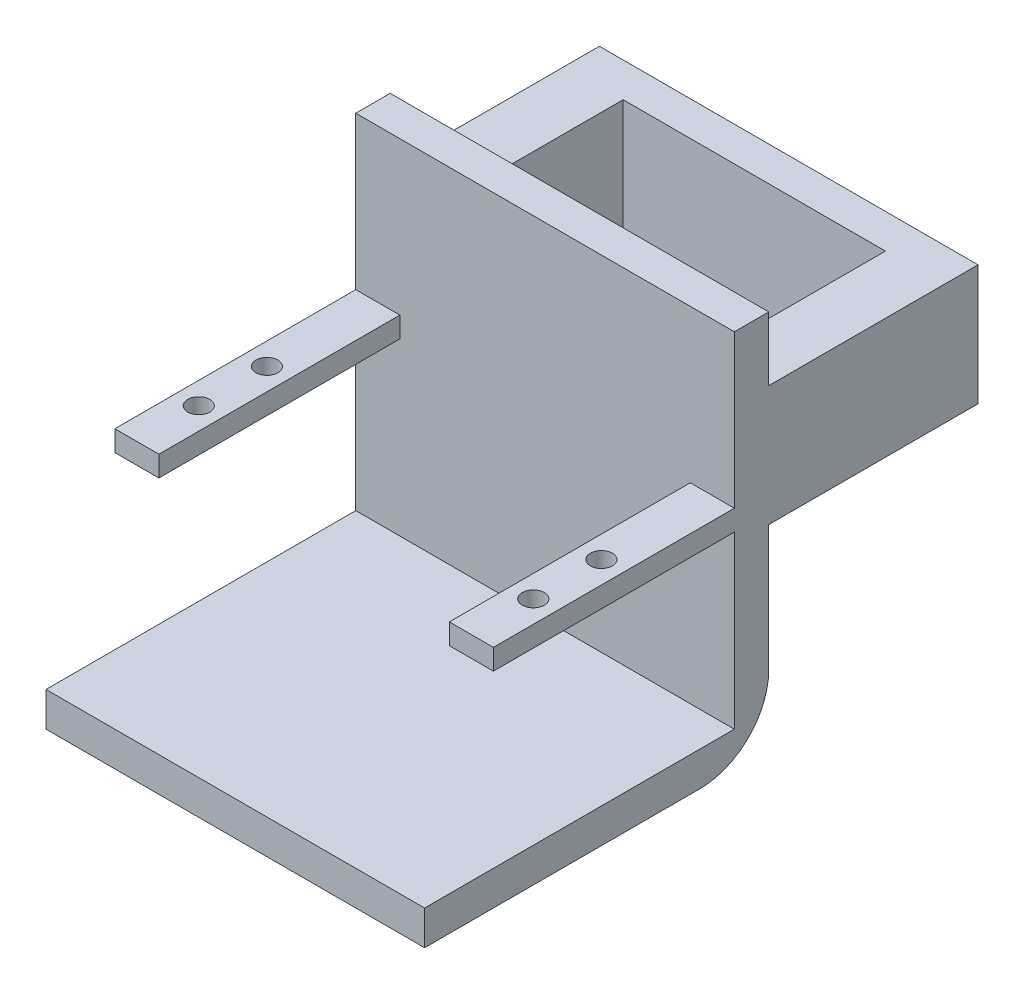
ISO-10303-21;
HEADER;
FILE_DESCRIPTION(('STEP AP214'),'2;1');
FILE_NAME('part.step','',(''),(''),'','','');
FILE_SCHEMA(('AUTOMOTIVE_DESIGN { 1 0 10303 214 1 1 1 1 }'));
ENDSEC;
DATA;
#1=APPLICATION_CONTEXT('core data for automotive mechanical design processes');
#2=APPLICATION_PROTOCOL_DEFINITION('international standard','automotive_design',2000,#1);
#3=PRODUCT_CONTEXT('',#1,'mechanical');
#4=PRODUCT('Part','Part','',(#3));
#5=PRODUCT_RELATED_PRODUCT_CATEGORY('part','',(#4));
#6=PRODUCT_DEFINITION_FORMATION('','',#4);
#7=PRODUCT_DEFINITION_CONTEXT('part definition',#1,'design');
#8=PRODUCT_DEFINITION('design','',#6,#7);
#9=PRODUCT_DEFINITION_SHAPE('','',#8);
#10=(LENGTH_UNIT() NAMED_UNIT(*) SI_UNIT(.MILLI.,.METRE.));
#11=(NAMED_UNIT(*) PLANE_ANGLE_UNIT() SI_UNIT($,.RADIAN.));
#12=(NAMED_UNIT(*) SI_UNIT($,.STERADIAN.) SOLID_ANGLE_UNIT());
#13=UNCERTAINTY_MEASURE_WITH_UNIT(LENGTH_MEASURE(1.E-05),#10,'distance_accuracy_value','');
#14=(GEOMETRIC_REPRESENTATION_CONTEXT(3) GLOBAL_UNCERTAINTY_ASSIGNED_CONTEXT((#13)) GLOBAL_UNIT_ASSIGNED_CONTEXT((#10,
#11,#12)) REPRESENTATION_CONTEXT('',''));
#15=CARTESIAN_POINT('',(0.,0.,0.));
#16=DIRECTION('',(0.,0.,1.));
#17=DIRECTION('',(1.,0.,0.));
#18=AXIS2_PLACEMENT_3D('',#15,#16,#17);
#19=CARTESIAN_POINT('',(0.,0.,0.));
#20=DIRECTION('',(0.,0.,1.));
#21=DIRECTION('',(1.,0.,0.));
#22=AXIS2_PLACEMENT_3D('',#19,#20,#21);
#23=PLANE('',#22);
#24=DIRECTION('',(-1.,0.,0.));
#25=VECTOR('',#24,1.);
#26=CARTESIAN_POINT('',(-11.9640127388535,1.13490563769142,0.));
#27=LINE('',#26,#25);
#28=CARTESIAN_POINT('',(-11.9640127388535,1.13490563769142,0.));
#29=VERTEX_POINT('',#28);
#30=CARTESIAN_POINT('',(-20.4140127388535,1.13490563769142,0.));
#31=VERTEX_POINT('',#30);
#32=EDGE_CURVE('E61',#29,#31,#27,.T.);
#33=ORIENTED_EDGE('',*,*,#32,.F.);
#34=DIRECTION('',(0.,-1.,0.));
#35=VECTOR('',#34,1.);
#36=CARTESIAN_POINT('',(-11.9640127388535,18.6220164240349,0.));
#37=LINE('',#36,#35);
#38=CARTESIAN_POINT('',(-11.9640127388535,18.6220164240349,0.));
#39=VERTEX_POINT('',#38);
#40=EDGE_CURVE('E249',#39,#29,#37,.T.);
#41=ORIENTED_EDGE('',*,*,#40,.F.);
#42=DIRECTION('',(1.,0.,0.));
#43=VECTOR('',#42,1.);
#44=CARTESIAN_POINT('',(-11.9640127388535,18.6220164240349,0.));
#45=LINE('',#44,#43);
#46=CARTESIAN_POINT('',(-20.4140127388535,18.6220164240349,0.));
#47=VERTEX_POINT('',#46);
#48=EDGE_CURVE('E248',#47,#39,#45,.T.);
#49=ORIENTED_EDGE('',*,*,#48,.F.);
#50=DIRECTION('',(0.,-1.,0.));
#51=VECTOR('',#50,1.);
#52=CARTESIAN_POINT('',(-20.4140127388535,27.8980891719745,0.));
#53=LINE('',#52,#51);
#54=CARTESIAN_POINT('',(-20.4140127388535,27.8980891719745,0.));
#55=VERTEX_POINT('',#54);
#56=EDGE_CURVE('E442',#55,#47,#53,.T.);
#57=ORIENTED_EDGE('',*,*,#56,.F.);
#58=DIRECTION('',(-1.,0.,0.));
#59=VECTOR('',#58,1.);
#60=CARTESIAN_POINT('',(-20.4140127388535,27.8980891719745,0.));
#61=LINE('',#60,#59);
#62=CARTESIAN_POINT('',(34.5859872611465,27.8980891719745,0.));
#63=VERTEX_POINT('',#62);
#64=EDGE_CURVE('E434',#63,#55,#61,.T.);
#65=ORIENTED_EDGE('',*,*,#64,.F.);
#66=DIRECTION('',(0.,1.,0.));
#67=VECTOR('',#66,1.);
#68=CARTESIAN_POINT('',(34.5859872611465,27.8980891719745,0.));
#69=LINE('',#68,#67);
#70=CARTESIAN_POINT('',(34.5859872611465,18.6220164240349,0.));
#71=VERTEX_POINT('',#70);
#72=EDGE_CURVE('E446',#71,#63,#69,.T.);
#73=ORIENTED_EDGE('',*,*,#72,.F.);
#74=DIRECTION('',(1.,0.,0.));
#75=VECTOR('',#74,1.);
#76=CARTESIAN_POINT('',(26.1359872611465,18.6220164240349,0.));
#77=LINE('',#76,#75);
#78=CARTESIAN_POINT('',(26.1359872611465,18.6220164240349,0.));
#79=VERTEX_POINT('',#78);
#80=EDGE_CURVE('E283',#79,#71,#77,.T.);
#81=ORIENTED_EDGE('',*,*,#80,.F.);
#82=DIRECTION('',(0.,1.,0.));
#83=VECTOR('',#82,1.);
#84=CARTESIAN_POINT('',(26.1359872611465,18.6220164240349,0.));
#85=LINE('',#84,#83);
#86=CARTESIAN_POINT('',(26.1359872611465,1.13490563769142,0.));
#87=VERTEX_POINT('',#86);
#88=EDGE_CURVE('E68',#87,#79,#85,.T.);
#89=ORIENTED_EDGE('',*,*,#88,.F.);
#90=DIRECTION('',(-1.,0.,0.));
#91=VECTOR('',#90,1.);
#92=CARTESIAN_POINT('',(26.1359872611465,1.13490563769142,0.));
#93=LINE('',#92,#91);
#94=CARTESIAN_POINT('',(34.5859872611465,1.13490563769142,0.));
#95=VERTEX_POINT('',#94);
#96=EDGE_CURVE('E253',#95,#87,#93,.T.);
#97=ORIENTED_EDGE('',*,*,#96,.F.);
#98=CARTESIAN_POINT('',(34.5859872611465,-17.1019108280255,0.));
#99=VERTEX_POINT('',#98);
#100=EDGE_CURVE('E208',#99,#95,#69,.T.);
#101=ORIENTED_EDGE('',*,*,#100,.F.);
#102=DIRECTION('',(-1.,0.,0.));
#103=VECTOR('',#102,1.);
#104=CARTESIAN_POINT('',(0.,-17.1019108280255,0.));
#105=LINE('',#104,#103);
#106=CARTESIAN_POINT('',(-20.4140127388535,-17.1019108280255,0.));
#107=VERTEX_POINT('',#106);
#108=EDGE_CURVE('E465',#99,#107,#105,.T.);
#109=ORIENTED_EDGE('',*,*,#108,.T.);
#110=EDGE_CURVE('E427',#31,#107,#53,.T.);
#111=ORIENTED_EDGE('',*,*,#110,.F.);
#112=EDGE_LOOP('',(#33,#41,#49,#57,#65,#73,#81,#89,#97,#101,#109,#111));
#113=FACE_BOUND('',#112,.T.);
#114=ADVANCED_FACE('F45',(#113),#23,.F.);
#115=CARTESIAN_POINT('',(0.,0.,5.));
#116=DIRECTION('',(0.,0.,1.));
#117=DIRECTION('',(1.,0.,0.));
#118=AXIS2_PLACEMENT_3D('',#115,#116,#117);
#119=PLANE('',#118);
#120=DIRECTION('',(0.,1.,0.));
#121=VECTOR('',#120,1.);
#122=CARTESIAN_POINT('',(34.5859872611465,27.8980891719745,5.));
#123=LINE('',#122,#121);
#124=CARTESIAN_POINT('',(34.5859872611465,-22.1019108280255,5.));
#125=VERTEX_POINT('',#124);
#126=CARTESIAN_POINT('',(34.5859872611465,2.69808917197453,5.));
#127=VERTEX_POINT('',#126);
#128=EDGE_CURVE('E413',#125,#127,#123,.T.);
#129=ORIENTED_EDGE('',*,*,#128,.T.);
#130=DIRECTION('',(1.,0.,0.));
#131=VECTOR('',#130,1.);
#132=CARTESIAN_POINT('',(28.1859872611465,2.69808917197453,5.));
#133=LINE('',#132,#131);
#134=CARTESIAN_POINT('',(28.1859872611465,2.69808917197453,5.));
#135=VERTEX_POINT('',#134);
#136=EDGE_CURVE('E341',#135,#127,#133,.T.);
#137=ORIENTED_EDGE('',*,*,#136,.F.);
#138=DIRECTION('',(0.,-1.,0.));
#139=VECTOR('',#138,1.);
#140=CARTESIAN_POINT('',(28.1859872611465,5.69808917197453,5.));
#141=LINE('',#140,#139);
#142=CARTESIAN_POINT('',(28.1859872611465,5.69808917197453,5.));
#143=VERTEX_POINT('',#142);
#144=EDGE_CURVE('E331',#143,#135,#141,.T.);
#145=ORIENTED_EDGE('',*,*,#144,.F.);
#146=DIRECTION('',(-1.,0.,0.));
#147=VECTOR('',#146,1.);
#148=CARTESIAN_POINT('',(34.5859872611465,5.69808917197453,5.));
#149=LINE('',#148,#147);
#150=CARTESIAN_POINT('',(34.5859872611465,5.69808917197453,5.));
#151=VERTEX_POINT('',#150);
#152=EDGE_CURVE('E345',#151,#143,#149,.T.);
#153=ORIENTED_EDGE('',*,*,#152,.F.);
#154=CARTESIAN_POINT('',(34.5859872611465,27.8980891719745,5.));
#155=VERTEX_POINT('',#154);
#156=EDGE_CURVE('E412',#151,#155,#123,.T.);
#157=ORIENTED_EDGE('',*,*,#156,.T.);
#158=DIRECTION('',(-1.,0.,0.));
#159=VECTOR('',#158,1.);
#160=CARTESIAN_POINT('',(-20.4140127388535,27.8980891719745,5.));
#161=LINE('',#160,#159);
#162=CARTESIAN_POINT('',(-20.4140127388535,27.8980891719745,5.));
#163=VERTEX_POINT('',#162);
#164=EDGE_CURVE('E417',#155,#163,#161,.T.);
#165=ORIENTED_EDGE('',*,*,#164,.T.);
#166=DIRECTION('',(0.,-1.,0.));
#167=VECTOR('',#166,1.);
#168=CARTESIAN_POINT('',(-20.4140127388535,27.8980891719745,5.));
#169=LINE('',#168,#167);
#170=CARTESIAN_POINT('',(-20.4140127388535,5.69808917197452,5.));
#171=VERTEX_POINT('',#170);
#172=EDGE_CURVE('E404',#163,#171,#169,.T.);
#173=ORIENTED_EDGE('',*,*,#172,.T.);
#174=DIRECTION('',(-1.,0.,0.));
#175=VECTOR('',#174,1.);
#176=CARTESIAN_POINT('',(-20.4140127388535,5.69808917197452,5.));
#177=LINE('',#176,#175);
#178=CARTESIAN_POINT('',(-14.0140127388535,5.69808917197452,5.));
#179=VERTEX_POINT('',#178);
#180=EDGE_CURVE('E381',#179,#171,#177,.T.);
#181=ORIENTED_EDGE('',*,*,#180,.F.);
#182=DIRECTION('',(0.,1.,0.));
#183=VECTOR('',#182,1.);
#184=CARTESIAN_POINT('',(-14.0140127388535,5.69808917197452,5.));
#185=LINE('',#184,#183);
#186=CARTESIAN_POINT('',(-14.0140127388535,2.69808917197453,5.));
#187=VERTEX_POINT('',#186);
#188=EDGE_CURVE('E385',#187,#179,#185,.T.);
#189=ORIENTED_EDGE('',*,*,#188,.F.);
#190=DIRECTION('',(1.,0.,0.));
#191=VECTOR('',#190,1.);
#192=CARTESIAN_POINT('',(-14.0140127388535,2.69808917197453,5.));
#193=LINE('',#192,#191);
#194=CARTESIAN_POINT('',(-20.4140127388535,2.69808917197453,5.));
#195=VERTEX_POINT('',#194);
#196=EDGE_CURVE('E346',#195,#187,#193,.T.);
#197=ORIENTED_EDGE('',*,*,#196,.F.);
#198=CARTESIAN_POINT('',(-20.4140127388535,-22.1019108280255,5.));
#199=VERTEX_POINT('',#198);
#200=EDGE_CURVE('E408',#195,#199,#169,.T.);
#201=ORIENTED_EDGE('',*,*,#200,.T.);
#202=DIRECTION('',(1.,0.,0.));
#203=VECTOR('',#202,1.);
#204=CARTESIAN_POINT('',(-20.4140127388535,-22.1019108280255,5.));
#205=LINE('',#204,#203);
#206=EDGE_CURVE('E407',#199,#125,#205,.T.);
#207=ORIENTED_EDGE('',*,*,#206,.T.);
#208=EDGE_LOOP('',(#129,#137,#145,#153,#157,#165,#173,#181,#189,#197,#201,#207));
#209=FACE_BOUND('',#208,.T.);
#210=ADVANCED_FACE('F510',(#209),#119,.T.);
#211=CARTESIAN_POINT('',(0.,-17.1019108280255,10.));
#212=DIRECTION('',(-1.,0.,0.));
#213=DIRECTION('',(0.,0.,1.));
#214=AXIS2_PLACEMENT_3D('',#211,#212,#213);
#215=CYLINDRICAL_SURFACE('',#214,10.);
#216=ORIENTED_EDGE('',*,*,#108,.F.);
#217=CARTESIAN_POINT('',(34.5859872611465,-17.1019108280255,10.));
#218=DIRECTION('',(-1.,0.,0.));
#219=DIRECTION('',(0.,-1.,0.));
#220=AXIS2_PLACEMENT_3D('',#217,#218,#219);
#221=CIRCLE('',#220,10.);
#222=CARTESIAN_POINT('',(34.5859872611465,-27.1019108280255,9.99999999999999));
#223=VERTEX_POINT('',#222);
#224=EDGE_CURVE('E54',#223,#99,#221,.F.);
#225=ORIENTED_EDGE('',*,*,#224,.F.);
#226=DIRECTION('',(-1.,0.,0.));
#227=VECTOR('',#226,1.);
#228=CARTESIAN_POINT('',(-20.4140127388535,-27.1019108280255,10.));
#229=LINE('',#228,#227);
#230=CARTESIAN_POINT('',(-20.4140127388535,-27.1019108280255,9.99999999999999));
#231=VERTEX_POINT('',#230);
#232=EDGE_CURVE('E469',#231,#223,#229,.F.);
#233=ORIENTED_EDGE('',*,*,#232,.F.);
#234=CARTESIAN_POINT('',(-20.4140127388535,-17.1019108280255,10.));
#235=DIRECTION('',(1.,0.,0.));
#236=DIRECTION('',(0.,1.,0.));
#237=AXIS2_PLACEMENT_3D('',#234,#235,#236);
#238=CIRCLE('',#237,10.);
#239=EDGE_CURVE('E11',#107,#231,#238,.F.);
#240=ORIENTED_EDGE('',*,*,#239,.F.);
#241=EDGE_LOOP('',(#216,#225,#233,#240));
#242=FACE_BOUND('',#241,.T.);
#243=ADVANCED_FACE('F47',(#242),#215,.T.);
#244=CARTESIAN_POINT('',(-20.4140127388535,27.8980891719745,50.));
#245=DIRECTION('',(0.,-1.,0.));
#246=DIRECTION('',(0.,0.,-1.));
#247=AXIS2_PLACEMENT_3D('',#244,#245,#246);
#248=PLANE('',#247);
#249=ORIENTED_EDGE('',*,*,#164,.F.);
#250=DIRECTION('',(0.,0.,-1.));
#251=VECTOR('',#250,1.);
#252=CARTESIAN_POINT('',(34.5859872611465,27.8980891719745,50.));
#253=LINE('',#252,#251);
#254=EDGE_CURVE('E454',#155,#63,#253,.T.);
#255=ORIENTED_EDGE('',*,*,#254,.T.);
#256=ORIENTED_EDGE('',*,*,#64,.T.);
#257=DIRECTION('',(0.,0.,-1.));
#258=VECTOR('',#257,1.);
#259=CARTESIAN_POINT('',(-20.4140127388535,27.8980891719745,50.));
#260=LINE('',#259,#258);
#261=EDGE_CURVE('E441',#163,#55,#260,.T.);
#262=ORIENTED_EDGE('',*,*,#261,.F.);
#263=EDGE_LOOP('',(#249,#255,#256,#262));
#264=FACE_BOUND('',#263,.T.);
#265=ADVANCED_FACE('F499',(#264),#248,.F.);
#266=CARTESIAN_POINT('',(-20.4140127388535,27.8980891719745,50.));
#267=DIRECTION('',(1.,0.,0.));
#268=DIRECTION('',(0.,1.,0.));
#269=AXIS2_PLACEMENT_3D('',#266,#267,#268);
#270=PLANE('',#269);
#271=ORIENTED_EDGE('',*,*,#56,.T.);
#272=DIRECTION('',(0.,0.,1.));
#273=VECTOR('',#272,1.);
#274=CARTESIAN_POINT('',(-20.4140127388535,18.6220164240349,-25.4));
#275=LINE('',#274,#273);
#276=CARTESIAN_POINT('',(-20.4140127388535,18.6220164240349,-30.4));
#277=VERTEX_POINT('',#276);
#278=EDGE_CURVE('E262',#277,#47,#275,.T.);
#279=ORIENTED_EDGE('',*,*,#278,.F.);
#280=DIRECTION('',(0.,1.,0.));
#281=VECTOR('',#280,1.);
#282=CARTESIAN_POINT('',(-20.4140127388535,1.13490563769142,-30.4));
#283=LINE('',#282,#281);
#284=CARTESIAN_POINT('',(-20.4140127388535,1.13490563769142,-30.4));
#285=VERTEX_POINT('',#284);
#286=EDGE_CURVE('E223',#285,#277,#283,.T.);
#287=ORIENTED_EDGE('',*,*,#286,.F.);
#288=DIRECTION('',(0.,0.,1.));
#289=VECTOR('',#288,1.);
#290=CARTESIAN_POINT('',(-20.4140127388535,1.13490563769142,-25.4));
#291=LINE('',#290,#289);
#292=EDGE_CURVE('E218',#285,#31,#291,.T.);
#293=ORIENTED_EDGE('',*,*,#292,.T.);
#294=ORIENTED_EDGE('',*,*,#110,.T.);
#295=ORIENTED_EDGE('',*,*,#239,.T.);
#296=DIRECTION('',(0.,0.,-1.));
#297=VECTOR('',#296,1.);
#298=CARTESIAN_POINT('',(-20.4140127388535,-27.1019108280255,50.));
#299=LINE('',#298,#297);
#300=CARTESIAN_POINT('',(-20.4140127388535,-27.1019108280255,50.));
#301=VERTEX_POINT('',#300);
#302=EDGE_CURVE('E461',#301,#231,#299,.T.);
#303=ORIENTED_EDGE('',*,*,#302,.F.);
#304=DIRECTION('',(0.,-1.,0.));
#305=VECTOR('',#304,1.);
#306=CARTESIAN_POINT('',(-20.4140127388535,27.8980891719745,50.));
#307=LINE('',#306,#305);
#308=CARTESIAN_POINT('',(-20.4140127388535,-22.1019108280255,50.));
#309=VERTEX_POINT('',#308);
#310=EDGE_CURVE('E430',#309,#301,#307,.T.);
#311=ORIENTED_EDGE('',*,*,#310,.F.);
#312=DIRECTION('',(0.,0.,1.));
#313=VECTOR('',#312,1.);
#314=CARTESIAN_POINT('',(-20.4140127388535,-22.1019108280255,5.));
#315=LINE('',#314,#313);
#316=EDGE_CURVE('E420',#199,#309,#315,.T.);
#317=ORIENTED_EDGE('',*,*,#316,.F.);
#318=ORIENTED_EDGE('',*,*,#200,.F.);
#319=DIRECTION('',(0.,0.,-1.));
#320=VECTOR('',#319,1.);
#321=CARTESIAN_POINT('',(-20.4140127388535,2.69808917197453,40.));
#322=LINE('',#321,#320);
#323=CARTESIAN_POINT('',(-20.4140127388535,2.69808917197453,40.));
#324=VERTEX_POINT('',#323);
#325=EDGE_CURVE('E376',#324,#195,#322,.T.);
#326=ORIENTED_EDGE('',*,*,#325,.F.);
#327=DIRECTION('',(0.,-1.,0.));
#328=VECTOR('',#327,1.);
#329=CARTESIAN_POINT('',(-20.4140127388535,2.69808917197453,40.));
#330=LINE('',#329,#328);
#331=CARTESIAN_POINT('',(-20.4140127388535,5.69808917197452,40.));
#332=VERTEX_POINT('',#331);
#333=EDGE_CURVE('E380',#332,#324,#330,.T.);
#334=ORIENTED_EDGE('',*,*,#333,.F.);
#335=DIRECTION('',(0.,0.,-1.));
#336=VECTOR('',#335,1.);
#337=CARTESIAN_POINT('',(-20.4140127388535,5.69808917197452,40.));
#338=LINE('',#337,#336);
#339=EDGE_CURVE('E372',#332,#171,#338,.T.);
#340=ORIENTED_EDGE('',*,*,#339,.T.);
#341=ORIENTED_EDGE('',*,*,#172,.F.);
#342=ORIENTED_EDGE('',*,*,#261,.T.);
#343=EDGE_LOOP('',(#271,#279,#287,#293,#294,#295,#303,#311,#317,#318,#326,#334,#340,#341,#342));
#344=FACE_BOUND('',#343,.T.);
#345=ADVANCED_FACE('F493',(#344),#270,.F.);
#346=CARTESIAN_POINT('',(-20.4140127388535,-27.1019108280255,50.));
#347=DIRECTION('',(0.,1.,0.));
#348=DIRECTION('',(0.,0.,1.));
#349=AXIS2_PLACEMENT_3D('',#346,#347,#348);
#350=PLANE('',#349);
#351=ORIENTED_EDGE('',*,*,#302,.T.);
#352=ORIENTED_EDGE('',*,*,#232,.T.);
#353=DIRECTION('',(0.,0.,-1.));
#354=VECTOR('',#353,1.);
#355=CARTESIAN_POINT('',(34.5859872611465,-27.1019108280255,50.));
#356=LINE('',#355,#354);
#357=CARTESIAN_POINT('',(34.5859872611465,-27.1019108280255,50.));
#358=VERTEX_POINT('',#357);
#359=EDGE_CURVE('E458',#358,#223,#356,.T.);
#360=ORIENTED_EDGE('',*,*,#359,.F.);
#361=DIRECTION('',(1.,0.,0.));
#362=VECTOR('',#361,1.);
#363=CARTESIAN_POINT('',(-20.4140127388535,-27.1019108280255,50.));
#364=LINE('',#363,#362);
#365=EDGE_CURVE('E433',#301,#358,#364,.T.);
#366=ORIENTED_EDGE('',*,*,#365,.F.);
#367=EDGE_LOOP('',(#351,#352,#360,#366));
#368=FACE_BOUND('',#367,.T.);
#369=ADVANCED_FACE('F523',(#368),#350,.F.);
#370=CARTESIAN_POINT('',(34.5859872611465,27.8980891719745,50.));
#371=DIRECTION('',(-1.,0.,0.));
#372=DIRECTION('',(0.,-1.,0.));
#373=AXIS2_PLACEMENT_3D('',#370,#371,#372);
#374=PLANE('',#373);
#375=ORIENTED_EDGE('',*,*,#359,.T.);
#376=ORIENTED_EDGE('',*,*,#224,.T.);
#377=ORIENTED_EDGE('',*,*,#100,.T.);
#378=DIRECTION('',(0.,0.,1.));
#379=VECTOR('',#378,1.);
#380=CARTESIAN_POINT('',(34.5859872611465,1.13490563769142,-25.4));
#381=LINE('',#380,#379);
#382=CARTESIAN_POINT('',(34.5859872611465,1.13490563769142,-30.4));
#383=VERTEX_POINT('',#382);
#384=EDGE_CURVE('E200',#383,#95,#381,.T.);
#385=ORIENTED_EDGE('',*,*,#384,.F.);
#386=DIRECTION('',(0.,-1.,0.));
#387=VECTOR('',#386,1.);
#388=CARTESIAN_POINT('',(34.5859872611465,1.13490563769142,-30.4));
#389=LINE('',#388,#387);
#390=CARTESIAN_POINT('',(34.5859872611465,18.6220164240349,-30.4));
#391=VERTEX_POINT('',#390);
#392=EDGE_CURVE('E206',#391,#383,#389,.T.);
#393=ORIENTED_EDGE('',*,*,#392,.F.);
#394=DIRECTION('',(0.,0.,1.));
#395=VECTOR('',#394,1.);
#396=CARTESIAN_POINT('',(34.5859872611465,18.6220164240349,-25.4));
#397=LINE('',#396,#395);
#398=EDGE_CURVE('E279',#391,#71,#397,.T.);
#399=ORIENTED_EDGE('',*,*,#398,.T.);
#400=ORIENTED_EDGE('',*,*,#72,.T.);
#401=ORIENTED_EDGE('',*,*,#254,.F.);
#402=ORIENTED_EDGE('',*,*,#156,.F.);
#403=DIRECTION('',(0.,0.,-1.));
#404=VECTOR('',#403,1.);
#405=CARTESIAN_POINT('',(34.5859872611465,5.69808917197453,40.));
#406=LINE('',#405,#404);
#407=CARTESIAN_POINT('',(34.5859872611465,5.69808917197453,40.));
#408=VERTEX_POINT('',#407);
#409=EDGE_CURVE('E358',#408,#151,#406,.T.);
#410=ORIENTED_EDGE('',*,*,#409,.F.);
#411=DIRECTION('',(0.,1.,0.));
#412=VECTOR('',#411,1.);
#413=CARTESIAN_POINT('',(34.5859872611465,2.69808917197453,40.));
#414=LINE('',#413,#412);
#415=CARTESIAN_POINT('',(34.5859872611465,2.69808917197453,40.));
#416=VERTEX_POINT('',#415);
#417=EDGE_CURVE('E330',#416,#408,#414,.T.);
#418=ORIENTED_EDGE('',*,*,#417,.F.);
#419=DIRECTION('',(0.,0.,-1.));
#420=VECTOR('',#419,1.);
#421=CARTESIAN_POINT('',(34.5859872611465,2.69808917197453,40.));
#422=LINE('',#421,#420);
#423=EDGE_CURVE('E361',#416,#127,#422,.T.);
#424=ORIENTED_EDGE('',*,*,#423,.T.);
#425=ORIENTED_EDGE('',*,*,#128,.F.);
#426=DIRECTION('',(0.,0.,1.));
#427=VECTOR('',#426,1.);
#428=CARTESIAN_POINT('',(34.5859872611465,-22.1019108280255,5.));
#429=LINE('',#428,#427);
#430=CARTESIAN_POINT('',(34.5859872611465,-22.1019108280255,50.));
#431=VERTEX_POINT('',#430);
#432=EDGE_CURVE('E423',#125,#431,#429,.T.);
#433=ORIENTED_EDGE('',*,*,#432,.T.);
#434=DIRECTION('',(0.,1.,0.));
#435=VECTOR('',#434,1.);
#436=CARTESIAN_POINT('',(34.5859872611465,27.8980891719745,50.));
#437=LINE('',#436,#435);
#438=EDGE_CURVE('E437',#358,#431,#437,.T.);
#439=ORIENTED_EDGE('',*,*,#438,.F.);
#440=EDGE_LOOP('',(#375,#376,#377,#385,#393,#399,#400,#401,#402,#410,#418,#424,#425,#433,#439));
#441=FACE_BOUND('',#440,.T.);
#442=ADVANCED_FACE('F203',(#441),#374,.F.);
#443=CARTESIAN_POINT('',(0.,0.,50.));
#444=DIRECTION('',(0.,0.,1.));
#445=DIRECTION('',(1.,0.,0.));
#446=AXIS2_PLACEMENT_3D('',#443,#444,#445);
#447=PLANE('',#446);
#448=DIRECTION('',(1.,0.,0.));
#449=VECTOR('',#448,1.);
#450=CARTESIAN_POINT('',(-20.4140127388535,-22.1019108280255,50.));
#451=LINE('',#450,#449);
#452=EDGE_CURVE('E364',#309,#431,#451,.T.);
#453=ORIENTED_EDGE('',*,*,#452,.F.);
#454=ORIENTED_EDGE('',*,*,#310,.T.);
#455=ORIENTED_EDGE('',*,*,#365,.T.);
#456=ORIENTED_EDGE('',*,*,#438,.T.);
#457=EDGE_LOOP('',(#453,#454,#455,#456));
#458=FACE_BOUND('',#457,.T.);
#459=ADVANCED_FACE('F521',(#458),#447,.T.);
#460=CARTESIAN_POINT('',(-20.4140127388535,-22.1019108280255,5.));
#461=DIRECTION('',(0.,-1.,0.));
#462=DIRECTION('',(0.,0.,-1.));
#463=AXIS2_PLACEMENT_3D('',#460,#461,#462);
#464=PLANE('',#463);
#465=ORIENTED_EDGE('',*,*,#452,.T.);
#466=ORIENTED_EDGE('',*,*,#432,.F.);
#467=ORIENTED_EDGE('',*,*,#206,.F.);
#468=ORIENTED_EDGE('',*,*,#316,.T.);
#469=EDGE_LOOP('',(#465,#466,#467,#468));
#470=FACE_BOUND('',#469,.T.);
#471=ADVANCED_FACE('F515',(#470),#464,.F.);
#472=CARTESIAN_POINT('',(-14.0140127388535,2.69808917197453,40.));
#473=DIRECTION('',(0.,1.,0.));
#474=DIRECTION('',(-1.,0.,0.));
#475=AXIS2_PLACEMENT_3D('',#472,#473,#474);
#476=PLANE('',#475);
#477=CARTESIAN_POINT('',(-17.2140127388535,2.69808917197453,31.01));
#478=DIRECTION('',(0.,1.,0.));
#479=DIRECTION('',(-1.,0.,0.));
#480=AXIS2_PLACEMENT_3D('',#477,#478,#479);
#481=CIRCLE('',#480,1.6);
#482=CARTESIAN_POINT('',(-18.8140127388535,2.69808917197453,31.01));
#483=VERTEX_POINT('',#482);
#484=EDGE_CURVE('E321',#483,#483,#481,.T.);
#485=ORIENTED_EDGE('',*,*,#484,.T.);
#486=EDGE_LOOP('',(#485));
#487=FACE_BOUND('',#486,.T.);
#488=CARTESIAN_POINT('',(-17.2140127388535,2.69808917197453,21.11));
#489=DIRECTION('',(0.,1.,0.));
#490=DIRECTION('',(-1.,0.,0.));
#491=AXIS2_PLACEMENT_3D('',#488,#489,#490);
#492=CIRCLE('',#491,1.6);
#493=CARTESIAN_POINT('',(-18.8140127388535,2.69808917197453,21.11));
#494=VERTEX_POINT('',#493);
#495=EDGE_CURVE('E317',#494,#494,#492,.T.);
#496=ORIENTED_EDGE('',*,*,#495,.T.);
#497=EDGE_LOOP('',(#496));
#498=FACE_BOUND('',#497,.T.);
#499=ORIENTED_EDGE('',*,*,#196,.T.);
#500=DIRECTION('',(0.,0.,-1.));
#501=VECTOR('',#500,1.);
#502=CARTESIAN_POINT('',(-14.0140127388535,2.69808917197453,40.));
#503=LINE('',#502,#501);
#504=CARTESIAN_POINT('',(-14.0140127388535,2.69808917197453,40.));
#505=VERTEX_POINT('',#504);
#506=EDGE_CURVE('E325',#505,#187,#503,.T.);
#507=ORIENTED_EDGE('',*,*,#506,.F.);
#508=DIRECTION('',(1.,0.,0.));
#509=VECTOR('',#508,1.);
#510=CARTESIAN_POINT('',(-14.0140127388535,2.69808917197453,40.));
#511=LINE('',#510,#509);
#512=EDGE_CURVE('E386',#324,#505,#511,.T.);
#513=ORIENTED_EDGE('',*,*,#512,.F.);
#514=ORIENTED_EDGE('',*,*,#325,.T.);
#515=EDGE_LOOP('',(#499,#507,#513,#514));
#516=FACE_BOUND('',#515,.T.);
#517=ADVANCED_FACE('F550',(#487,#498,#516),#476,.F.);
#518=CARTESIAN_POINT('',(-14.0140127388535,5.69808917197452,40.));
#519=DIRECTION('',(-1.,0.,0.));
#520=DIRECTION('',(0.,0.,1.));
#521=AXIS2_PLACEMENT_3D('',#518,#519,#520);
#522=PLANE('',#521);
#523=ORIENTED_EDGE('',*,*,#188,.T.);
#524=DIRECTION('',(0.,0.,-1.));
#525=VECTOR('',#524,1.);
#526=CARTESIAN_POINT('',(-14.0140127388535,5.69808917197452,40.));
#527=LINE('',#526,#525);
#528=CARTESIAN_POINT('',(-14.0140127388535,5.69808917197452,40.));
#529=VERTEX_POINT('',#528);
#530=EDGE_CURVE('E368',#529,#179,#527,.T.);
#531=ORIENTED_EDGE('',*,*,#530,.F.);
#532=DIRECTION('',(0.,1.,0.));
#533=VECTOR('',#532,1.);
#534=CARTESIAN_POINT('',(-14.0140127388535,5.69808917197452,40.));
#535=LINE('',#534,#533);
#536=EDGE_CURVE('E398',#505,#529,#535,.T.);
#537=ORIENTED_EDGE('',*,*,#536,.F.);
#538=ORIENTED_EDGE('',*,*,#506,.T.);
#539=EDGE_LOOP('',(#523,#531,#537,#538));
#540=FACE_BOUND('',#539,.T.);
#541=ADVANCED_FACE('F546',(#540),#522,.F.);
#542=CARTESIAN_POINT('',(-20.4140127388535,5.69808917197452,40.));
#543=DIRECTION('',(0.,-1.,0.));
#544=DIRECTION('',(1.,0.,0.));
#545=AXIS2_PLACEMENT_3D('',#542,#543,#544);
#546=PLANE('',#545);
#547=CARTESIAN_POINT('',(-17.2140127388535,5.69808917197452,31.01));
#548=DIRECTION('',(0.,1.,0.));
#549=DIRECTION('',(-1.,0.,0.));
#550=AXIS2_PLACEMENT_3D('',#547,#548,#549);
#551=CIRCLE('',#550,1.6);
#552=CARTESIAN_POINT('',(-18.8140127388535,5.69808917197452,31.01));
#553=VERTEX_POINT('',#552);
#554=EDGE_CURVE('E294',#553,#553,#551,.T.);
#555=ORIENTED_EDGE('',*,*,#554,.F.);
#556=EDGE_LOOP('',(#555));
#557=FACE_BOUND('',#556,.T.);
#558=CARTESIAN_POINT('',(-17.2140127388535,5.69808917197452,21.11));
#559=DIRECTION('',(0.,1.,0.));
#560=DIRECTION('',(-1.,0.,0.));
#561=AXIS2_PLACEMENT_3D('',#558,#559,#560);
#562=CIRCLE('',#561,1.6);
#563=CARTESIAN_POINT('',(-18.8140127388535,5.69808917197452,21.11));
#564=VERTEX_POINT('',#563);
#565=EDGE_CURVE('E298',#564,#564,#562,.T.);
#566=ORIENTED_EDGE('',*,*,#565,.F.);
#567=EDGE_LOOP('',(#566));
#568=FACE_BOUND('',#567,.T.);
#569=ORIENTED_EDGE('',*,*,#180,.T.);
#570=ORIENTED_EDGE('',*,*,#339,.F.);
#571=DIRECTION('',(-1.,0.,0.));
#572=VECTOR('',#571,1.);
#573=CARTESIAN_POINT('',(-20.4140127388535,5.69808917197452,40.));
#574=LINE('',#573,#572);
#575=EDGE_CURVE('E395',#529,#332,#574,.T.);
#576=ORIENTED_EDGE('',*,*,#575,.F.);
#577=ORIENTED_EDGE('',*,*,#530,.T.);
#578=EDGE_LOOP('',(#569,#570,#576,#577));
#579=FACE_BOUND('',#578,.T.);
#580=ADVANCED_FACE('F543',(#557,#568,#579),#546,.F.);
#581=CARTESIAN_POINT('',(0.,0.,40.));
#582=DIRECTION('',(0.,0.,-1.));
#583=DIRECTION('',(-1.,0.,0.));
#584=AXIS2_PLACEMENT_3D('',#581,#582,#583);
#585=PLANE('',#584);
#586=ORIENTED_EDGE('',*,*,#512,.T.);
#587=ORIENTED_EDGE('',*,*,#536,.T.);
#588=ORIENTED_EDGE('',*,*,#575,.T.);
#589=ORIENTED_EDGE('',*,*,#333,.T.);
#590=EDGE_LOOP('',(#586,#587,#588,#589));
#591=FACE_BOUND('',#590,.T.);
#592=ADVANCED_FACE('F552',(#591),#585,.F.);
#593=CARTESIAN_POINT('',(28.1859872611465,2.69808917197453,40.));
#594=DIRECTION('',(0.,1.,0.));
#595=DIRECTION('',(-1.,0.,0.));
#596=AXIS2_PLACEMENT_3D('',#593,#594,#595);
#597=PLANE('',#596);
#598=CARTESIAN_POINT('',(31.3859872611465,2.69808917197453,21.11));
#599=DIRECTION('',(0.,1.,0.));
#600=DIRECTION('',(-1.,0.,0.));
#601=AXIS2_PLACEMENT_3D('',#598,#599,#600);
#602=CIRCLE('',#601,1.6);
#603=CARTESIAN_POINT('',(29.7859872611465,2.69808917197453,21.11));
#604=VERTEX_POINT('',#603);
#605=EDGE_CURVE('E313',#604,#604,#602,.T.);
#606=ORIENTED_EDGE('',*,*,#605,.T.);
#607=EDGE_LOOP('',(#606));
#608=FACE_BOUND('',#607,.T.);
#609=CARTESIAN_POINT('',(31.3859872611465,2.69808917197453,31.01));
#610=DIRECTION('',(0.,1.,0.));
#611=DIRECTION('',(-1.,0.,0.));
#612=AXIS2_PLACEMENT_3D('',#609,#610,#611);
#613=CIRCLE('',#612,1.6);
#614=CARTESIAN_POINT('',(29.7859872611465,2.69808917197453,31.01));
#615=VERTEX_POINT('',#614);
#616=EDGE_CURVE('E309',#615,#615,#613,.T.);
#617=ORIENTED_EDGE('',*,*,#616,.T.);
#618=EDGE_LOOP('',(#617));
#619=FACE_BOUND('',#618,.T.);
#620=ORIENTED_EDGE('',*,*,#136,.T.);
#621=ORIENTED_EDGE('',*,*,#423,.F.);
#622=DIRECTION('',(1.,0.,0.));
#623=VECTOR('',#622,1.);
#624=CARTESIAN_POINT('',(28.1859872611465,2.69808917197453,40.));
#625=LINE('',#624,#623);
#626=CARTESIAN_POINT('',(28.1859872611465,2.69808917197453,40.));
#627=VERTEX_POINT('',#626);
#628=EDGE_CURVE('E326',#627,#416,#625,.T.);
#629=ORIENTED_EDGE('',*,*,#628,.F.);
#630=DIRECTION('',(0.,0.,-1.));
#631=VECTOR('',#630,1.);
#632=CARTESIAN_POINT('',(28.1859872611465,2.69808917197453,40.));
#633=LINE('',#632,#631);
#634=EDGE_CURVE('E340',#627,#135,#633,.T.);
#635=ORIENTED_EDGE('',*,*,#634,.T.);
#636=EDGE_LOOP('',(#620,#621,#629,#635));
#637=FACE_BOUND('',#636,.T.);
#638=ADVANCED_FACE('F529',(#608,#619,#637),#597,.F.);
#639=CARTESIAN_POINT('',(34.5859872611465,5.69808917197453,40.));
#640=DIRECTION('',(0.,-1.,0.));
#641=DIRECTION('',(1.,0.,0.));
#642=AXIS2_PLACEMENT_3D('',#639,#640,#641);
#643=PLANE('',#642);
#644=CARTESIAN_POINT('',(31.3859872611465,5.69808917197452,21.11));
#645=DIRECTION('',(0.,1.,0.));
#646=DIRECTION('',(-1.,0.,0.));
#647=AXIS2_PLACEMENT_3D('',#644,#645,#646);
#648=CIRCLE('',#647,1.6);
#649=CARTESIAN_POINT('',(29.7859872611465,5.69808917197452,21.11));
#650=VERTEX_POINT('',#649);
#651=EDGE_CURVE('E270',#650,#650,#648,.T.);
#652=ORIENTED_EDGE('',*,*,#651,.F.);
#653=EDGE_LOOP('',(#652));
#654=FACE_BOUND('',#653,.T.);
#655=CARTESIAN_POINT('',(31.3859872611465,5.69808917197452,31.01));
#656=DIRECTION('',(0.,1.,0.));
#657=DIRECTION('',(-1.,0.,0.));
#658=AXIS2_PLACEMENT_3D('',#655,#656,#657);
#659=CIRCLE('',#658,1.6);
#660=CARTESIAN_POINT('',(29.7859872611465,5.69808917197452,31.01));
#661=VERTEX_POINT('',#660);
#662=EDGE_CURVE('E299',#661,#661,#659,.T.);
#663=ORIENTED_EDGE('',*,*,#662,.F.);
#664=EDGE_LOOP('',(#663));
#665=FACE_BOUND('',#664,.T.);
#666=ORIENTED_EDGE('',*,*,#152,.T.);
#667=DIRECTION('',(0.,0.,-1.));
#668=VECTOR('',#667,1.);
#669=CARTESIAN_POINT('',(28.1859872611465,5.69808917197453,40.));
#670=LINE('',#669,#668);
#671=CARTESIAN_POINT('',(28.1859872611465,5.69808917197453,40.));
#672=VERTEX_POINT('',#671);
#673=EDGE_CURVE('E355',#672,#143,#670,.T.);
#674=ORIENTED_EDGE('',*,*,#673,.F.);
#675=DIRECTION('',(-1.,0.,0.));
#676=VECTOR('',#675,1.);
#677=CARTESIAN_POINT('',(34.5859872611465,5.69808917197453,40.));
#678=LINE('',#677,#676);
#679=EDGE_CURVE('E334',#408,#672,#678,.T.);
#680=ORIENTED_EDGE('',*,*,#679,.F.);
#681=ORIENTED_EDGE('',*,*,#409,.T.);
#682=EDGE_LOOP('',(#666,#674,#680,#681));
#683=FACE_BOUND('',#682,.T.);
#684=ADVANCED_FACE('F538',(#654,#665,#683),#643,.F.);
#685=CARTESIAN_POINT('',(28.1859872611465,5.69808917197453,40.));
#686=DIRECTION('',(1.,0.,0.));
#687=DIRECTION('',(0.,0.,-1.));
#688=AXIS2_PLACEMENT_3D('',#685,#686,#687);
#689=PLANE('',#688);
#690=ORIENTED_EDGE('',*,*,#144,.T.);
#691=ORIENTED_EDGE('',*,*,#634,.F.);
#692=DIRECTION('',(0.,-1.,0.));
#693=VECTOR('',#692,1.);
#694=CARTESIAN_POINT('',(28.1859872611465,5.69808917197453,40.));
#695=LINE('',#694,#693);
#696=EDGE_CURVE('E337',#672,#627,#695,.T.);
#697=ORIENTED_EDGE('',*,*,#696,.F.);
#698=ORIENTED_EDGE('',*,*,#673,.T.);
#699=EDGE_LOOP('',(#690,#691,#697,#698));
#700=FACE_BOUND('',#699,.T.);
#701=ADVANCED_FACE('F534',(#700),#689,.F.);
#702=CARTESIAN_POINT('',(0.,0.,40.));
#703=DIRECTION('',(0.,0.,1.));
#704=DIRECTION('',(1.,0.,0.));
#705=AXIS2_PLACEMENT_3D('',#702,#703,#704);
#706=PLANE('',#705);
#707=ORIENTED_EDGE('',*,*,#628,.T.);
#708=ORIENTED_EDGE('',*,*,#417,.T.);
#709=ORIENTED_EDGE('',*,*,#679,.T.);
#710=ORIENTED_EDGE('',*,*,#696,.T.);
#711=EDGE_LOOP('',(#707,#708,#709,#710));
#712=FACE_BOUND('',#711,.T.);
#713=ADVANCED_FACE('F683',(#712),#706,.T.);
#714=CARTESIAN_POINT('',(31.3859872611465,-4.30191082802548,31.01));
#715=DIRECTION('',(0.,1.,0.));
#716=DIRECTION('',(-1.,0.,0.));
#717=AXIS2_PLACEMENT_3D('',#714,#715,#716);
#718=CYLINDRICAL_SURFACE('',#717,1.6);
#719=ORIENTED_EDGE('',*,*,#662,.T.);
#720=EDGE_LOOP('',(#719));
#721=FACE_BOUND('',#720,.T.);
#722=ORIENTED_EDGE('',*,*,#616,.F.);
#723=EDGE_LOOP('',(#722));
#724=FACE_BOUND('',#723,.T.);
#725=ADVANCED_FACE('F674',(#721,#724),#718,.F.);
#726=CARTESIAN_POINT('',(31.3859872611465,-4.30191082802548,21.11));
#727=DIRECTION('',(0.,1.,0.));
#728=DIRECTION('',(-1.,0.,0.));
#729=AXIS2_PLACEMENT_3D('',#726,#727,#728);
#730=CYLINDRICAL_SURFACE('',#729,1.6);
#731=ORIENTED_EDGE('',*,*,#651,.T.);
#732=EDGE_LOOP('',(#731));
#733=FACE_BOUND('',#732,.T.);
#734=ORIENTED_EDGE('',*,*,#605,.F.);
#735=EDGE_LOOP('',(#734));
#736=FACE_BOUND('',#735,.T.);
#737=ADVANCED_FACE('F665',(#733,#736),#730,.F.);
#738=CARTESIAN_POINT('',(-17.2140127388535,-4.30191082802548,21.11));
#739=DIRECTION('',(0.,1.,0.));
#740=DIRECTION('',(-1.,0.,0.));
#741=AXIS2_PLACEMENT_3D('',#738,#739,#740);
#742=CYLINDRICAL_SURFACE('',#741,1.6);
#743=ORIENTED_EDGE('',*,*,#565,.T.);
#744=EDGE_LOOP('',(#743));
#745=FACE_BOUND('',#744,.T.);
#746=ORIENTED_EDGE('',*,*,#495,.F.);
#747=EDGE_LOOP('',(#746));
#748=FACE_BOUND('',#747,.T.);
#749=ADVANCED_FACE('F656',(#745,#748),#742,.F.);
#750=CARTESIAN_POINT('',(-17.2140127388535,-4.30191082802548,31.01));
#751=DIRECTION('',(0.,1.,0.));
#752=DIRECTION('',(-1.,0.,0.));
#753=AXIS2_PLACEMENT_3D('',#750,#751,#752);
#754=CYLINDRICAL_SURFACE('',#753,1.6);
#755=ORIENTED_EDGE('',*,*,#554,.T.);
#756=EDGE_LOOP('',(#755));
#757=FACE_BOUND('',#756,.T.);
#758=ORIENTED_EDGE('',*,*,#484,.F.);
#759=EDGE_LOOP('',(#758));
#760=FACE_BOUND('',#759,.T.);
#761=ADVANCED_FACE('F597',(#757,#760),#754,.F.);
#762=CARTESIAN_POINT('',(26.1359872611465,18.6220164240349,-25.4));
#763=DIRECTION('',(1.,0.,0.));
#764=DIRECTION('',(0.,0.,-1.));
#765=AXIS2_PLACEMENT_3D('',#762,#763,#764);
#766=PLANE('',#765);
#767=ORIENTED_EDGE('',*,*,#88,.T.);
#768=DIRECTION('',(0.,0.,1.));
#769=VECTOR('',#768,1.);
#770=CARTESIAN_POINT('',(26.1359872611465,18.6220164240349,-25.4));
#771=LINE('',#770,#769);
#772=CARTESIAN_POINT('',(26.1359872611465,18.6220164240349,-25.4));
#773=VERTEX_POINT('',#772);
#774=EDGE_CURVE('E275',#773,#79,#771,.T.);
#775=ORIENTED_EDGE('',*,*,#774,.F.);
#776=DIRECTION('',(0.,1.,0.));
#777=VECTOR('',#776,1.);
#778=CARTESIAN_POINT('',(26.1359872611465,18.6220164240349,-25.4));
#779=LINE('',#778,#777);
#780=CARTESIAN_POINT('',(26.1359872611465,1.13490563769142,-25.4));
#781=VERTEX_POINT('',#780);
#782=EDGE_CURVE('E282',#781,#773,#779,.T.);
#783=ORIENTED_EDGE('',*,*,#782,.F.);
#784=DIRECTION('',(0.,0.,1.));
#785=VECTOR('',#784,1.);
#786=CARTESIAN_POINT('',(26.1359872611465,1.13490563769142,-25.4));
#787=LINE('',#786,#785);
#788=EDGE_CURVE('E211',#781,#87,#787,.T.);
#789=ORIENTED_EDGE('',*,*,#788,.T.);
#790=EDGE_LOOP('',(#767,#775,#783,#789));
#791=FACE_BOUND('',#790,.T.);
#792=ADVANCED_FACE('F481',(#791),#766,.F.);
#793=CARTESIAN_POINT('',(-11.9640127388535,18.6220164240349,-25.4));
#794=DIRECTION('',(-1.,0.,0.));
#795=DIRECTION('',(0.,0.,1.));
#796=AXIS2_PLACEMENT_3D('',#793,#794,#795);
#797=PLANE('',#796);
#798=ORIENTED_EDGE('',*,*,#40,.T.);
#799=DIRECTION('',(0.,0.,1.));
#800=VECTOR('',#799,1.);
#801=CARTESIAN_POINT('',(-11.9640127388535,1.13490563769142,-25.4));
#802=LINE('',#801,#800);
#803=CARTESIAN_POINT('',(-11.9640127388535,1.13490563769142,-25.4));
#804=VERTEX_POINT('',#803);
#805=EDGE_CURVE('E268',#804,#29,#802,.T.);
#806=ORIENTED_EDGE('',*,*,#805,.F.);
#807=DIRECTION('',(0.,-1.,0.));
#808=VECTOR('',#807,1.);
#809=CARTESIAN_POINT('',(-11.9640127388535,18.6220164240349,-25.4));
#810=LINE('',#809,#808);
#811=CARTESIAN_POINT('',(-11.9640127388535,18.6220164240349,-25.4));
#812=VERTEX_POINT('',#811);
#813=EDGE_CURVE('E243',#812,#804,#810,.T.);
#814=ORIENTED_EDGE('',*,*,#813,.F.);
#815=DIRECTION('',(0.,0.,1.));
#816=VECTOR('',#815,1.);
#817=CARTESIAN_POINT('',(-11.9640127388535,18.6220164240349,-25.4));
#818=LINE('',#817,#816);
#819=EDGE_CURVE('E247',#812,#39,#818,.T.);
#820=ORIENTED_EDGE('',*,*,#819,.T.);
#821=EDGE_LOOP('',(#798,#806,#814,#820));
#822=FACE_BOUND('',#821,.T.);
#823=ADVANCED_FACE('F488',(#822),#797,.F.);
#824=CARTESIAN_POINT('',(-11.9640127388535,1.13490563769142,-25.4));
#825=DIRECTION('',(0.,1.,0.));
#826=DIRECTION('',(0.,0.,1.));
#827=AXIS2_PLACEMENT_3D('',#824,#825,#826);
#828=PLANE('',#827);
#829=ORIENTED_EDGE('',*,*,#32,.T.);
#830=ORIENTED_EDGE('',*,*,#292,.F.);
#831=DIRECTION('',(-1.,0.,0.));
#832=VECTOR('',#831,1.);
#833=CARTESIAN_POINT('',(34.5859872611465,1.13490563769142,-30.4));
#834=LINE('',#833,#832);
#835=EDGE_CURVE('E215',#383,#285,#834,.T.);
#836=ORIENTED_EDGE('',*,*,#835,.F.);
#837=ORIENTED_EDGE('',*,*,#384,.T.);
#838=ORIENTED_EDGE('',*,*,#96,.T.);
#839=ORIENTED_EDGE('',*,*,#788,.F.);
#840=DIRECTION('',(-1.,0.,0.));
#841=VECTOR('',#840,1.);
#842=CARTESIAN_POINT('',(34.5859872611465,1.13490563769142,-25.4));
#843=LINE('',#842,#841);
#844=EDGE_CURVE('E233',#781,#804,#843,.T.);
#845=ORIENTED_EDGE('',*,*,#844,.T.);
#846=ORIENTED_EDGE('',*,*,#805,.T.);
#847=EDGE_LOOP('',(#829,#830,#836,#837,#838,#839,#845,#846));
#848=FACE_BOUND('',#847,.T.);
#849=ADVANCED_FACE('F216',(#848),#828,.F.);
#850=CARTESIAN_POINT('',(-11.9640127388535,18.6220164240349,-25.4));
#851=DIRECTION('',(0.,-1.,0.));
#852=DIRECTION('',(0.,0.,-1.));
#853=AXIS2_PLACEMENT_3D('',#850,#851,#852);
#854=PLANE('',#853);
#855=ORIENTED_EDGE('',*,*,#48,.T.);
#856=ORIENTED_EDGE('',*,*,#819,.F.);
#857=DIRECTION('',(1.,0.,0.));
#858=VECTOR('',#857,1.);
#859=CARTESIAN_POINT('',(34.5859872611465,18.6220164240349,-25.4));
#860=LINE('',#859,#858);
#861=EDGE_CURVE('E229',#812,#773,#860,.T.);
#862=ORIENTED_EDGE('',*,*,#861,.T.);
#863=ORIENTED_EDGE('',*,*,#774,.T.);
#864=ORIENTED_EDGE('',*,*,#80,.T.);
#865=ORIENTED_EDGE('',*,*,#398,.F.);
#866=DIRECTION('',(1.,0.,0.));
#867=VECTOR('',#866,1.);
#868=CARTESIAN_POINT('',(34.5859872611465,18.6220164240349,-30.4));
#869=LINE('',#868,#867);
#870=EDGE_CURVE('E212',#277,#391,#869,.T.);
#871=ORIENTED_EDGE('',*,*,#870,.F.);
#872=ORIENTED_EDGE('',*,*,#278,.T.);
#873=EDGE_LOOP('',(#855,#856,#862,#863,#864,#865,#871,#872));
#874=FACE_BOUND('',#873,.T.);
#875=ADVANCED_FACE('F491',(#874),#854,.F.);
#876=CARTESIAN_POINT('',(0.,0.,-30.4));
#877=DIRECTION('',(0.,0.,1.));
#878=DIRECTION('',(1.,0.,0.));
#879=AXIS2_PLACEMENT_3D('',#876,#877,#878);
#880=PLANE('',#879);
#881=ORIENTED_EDGE('',*,*,#392,.T.);
#882=ORIENTED_EDGE('',*,*,#835,.T.);
#883=ORIENTED_EDGE('',*,*,#286,.T.);
#884=ORIENTED_EDGE('',*,*,#870,.T.);
#885=EDGE_LOOP('',(#881,#882,#883,#884));
#886=FACE_BOUND('',#885,.T.);
#887=ADVANCED_FACE('F226',(#886),#880,.F.);
#888=CARTESIAN_POINT('',(0.,0.,-25.4));
#889=DIRECTION('',(0.,0.,1.));
#890=DIRECTION('',(1.,0.,0.));
#891=AXIS2_PLACEMENT_3D('',#888,#889,#890);
#892=PLANE('',#891);
#893=ORIENTED_EDGE('',*,*,#844,.F.);
#894=ORIENTED_EDGE('',*,*,#782,.T.);
#895=ORIENTED_EDGE('',*,*,#861,.F.);
#896=ORIENTED_EDGE('',*,*,#813,.T.);
#897=EDGE_LOOP('',(#893,#894,#895,#896));
#898=FACE_BOUND('',#897,.T.);
#899=ADVANCED_FACE('F485',(#898),#892,.T.);
#900=CLOSED_SHELL('',(#114,#210,#243,#265,#345,#369,#442,#459,#471,#517,#541,#580,#592,#638,
#684,#701,#713,#725,#737,#749,#761,#792,#823,#849,#875,#887,#899));
#901=MANIFOLD_SOLID_BREP('B2',#900);
#902=ADVANCED_BREP_SHAPE_REPRESENTATION('',(#18,#901),#14);
#903=SHAPE_DEFINITION_REPRESENTATION(#9,#902);
ENDSEC;
END-ISO-10303-21;
